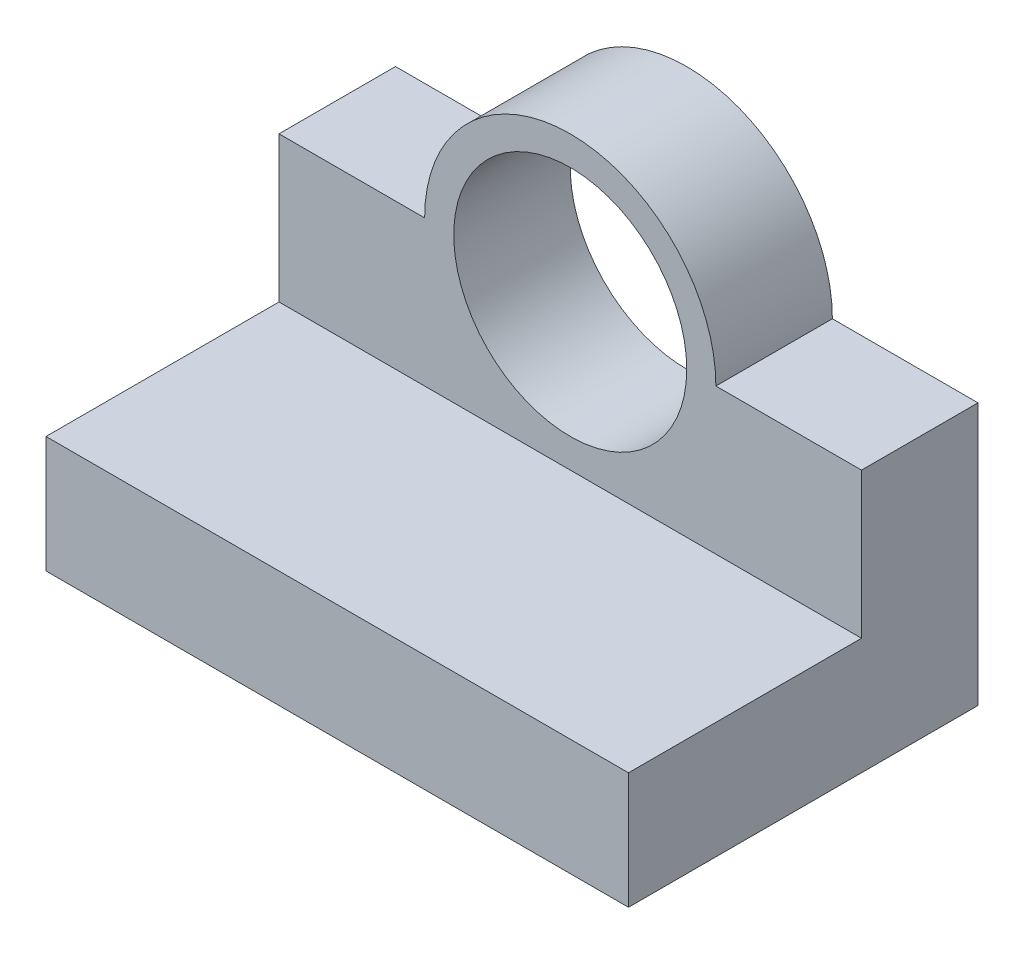
ISO-10303-21;
HEADER;
FILE_DESCRIPTION(('STEP AP214'),'2;1');
FILE_NAME('part.step','',(''),(''),'','','');
FILE_SCHEMA(('AUTOMOTIVE_DESIGN { 1 0 10303 214 1 1 1 1 }'));
ENDSEC;
DATA;
#1=APPLICATION_CONTEXT('core data for automotive mechanical design processes');
#2=APPLICATION_PROTOCOL_DEFINITION('international standard','automotive_design',2000,#1);
#3=PRODUCT_CONTEXT('',#1,'mechanical');
#4=PRODUCT('Part','Part','',(#3));
#5=PRODUCT_RELATED_PRODUCT_CATEGORY('part','',(#4));
#6=PRODUCT_DEFINITION_FORMATION('','',#4);
#7=PRODUCT_DEFINITION_CONTEXT('part definition',#1,'design');
#8=PRODUCT_DEFINITION('design','',#6,#7);
#9=PRODUCT_DEFINITION_SHAPE('','',#8);
#10=(LENGTH_UNIT() NAMED_UNIT(*) SI_UNIT(.MILLI.,.METRE.));
#11=(NAMED_UNIT(*) PLANE_ANGLE_UNIT() SI_UNIT($,.RADIAN.));
#12=(NAMED_UNIT(*) SI_UNIT($,.STERADIAN.) SOLID_ANGLE_UNIT());
#13=UNCERTAINTY_MEASURE_WITH_UNIT(LENGTH_MEASURE(1.E-05),#10,'distance_accuracy_value','');
#14=(GEOMETRIC_REPRESENTATION_CONTEXT(3) GLOBAL_UNCERTAINTY_ASSIGNED_CONTEXT((#13)) GLOBAL_UNIT_ASSIGNED_CONTEXT((#10,
#11,#12)) REPRESENTATION_CONTEXT('',''));
#15=CARTESIAN_POINT('',(0.,0.,0.));
#16=DIRECTION('',(0.,0.,1.));
#17=DIRECTION('',(1.,0.,0.));
#18=AXIS2_PLACEMENT_3D('',#15,#16,#17);
#19=CARTESIAN_POINT('',(0.,0.,20.));
#20=DIRECTION('',(0.,0.,1.));
#21=DIRECTION('',(1.,0.,0.));
#22=AXIS2_PLACEMENT_3D('',#19,#20,#21);
#23=PLANE('',#22);
#24=CARTESIAN_POINT('',(14.3829787234043,12.3510638297872,20.));
#25=DIRECTION('',(0.,0.,1.));
#26=DIRECTION('',(1.,0.,0.));
#27=AXIS2_PLACEMENT_3D('',#24,#25,#26);
#28=CIRCLE('',#27,20.);
#29=CARTESIAN_POINT('',(34.3829787234043,12.3510638297872,20.));
#30=VERTEX_POINT('',#29);
#31=EDGE_CURVE('E166',#30,#30,#28,.T.);
#32=ORIENTED_EDGE('',*,*,#31,.F.);
#33=EDGE_LOOP('',(#32));
#34=FACE_BOUND('',#33,.T.);
#35=DIRECTION('',(0.,-1.,0.));
#36=VECTOR('',#35,1.);
#37=CARTESIAN_POINT('',(-35.6170212765957,0.,20.));
#38=LINE('',#37,#36);
#39=CARTESIAN_POINT('',(-35.6170212765957,12.3510638297872,20.));
#40=VERTEX_POINT('',#39);
#41=CARTESIAN_POINT('',(-35.6170212765957,-12.6489361702128,20.));
#42=VERTEX_POINT('',#41);
#43=EDGE_CURVE('E159',#40,#42,#38,.T.);
#44=ORIENTED_EDGE('',*,*,#43,.T.);
#45=DIRECTION('',(1.,0.,0.));
#46=VECTOR('',#45,1.);
#47=CARTESIAN_POINT('',(-35.6170212765957,-12.6489361702128,20.));
#48=LINE('',#47,#46);
#49=CARTESIAN_POINT('',(64.3829787234043,-12.6489361702128,20.));
#50=VERTEX_POINT('',#49);
#51=EDGE_CURVE('E139',#42,#50,#48,.T.);
#52=ORIENTED_EDGE('',*,*,#51,.T.);
#53=DIRECTION('',(0.,-1.,0.));
#54=VECTOR('',#53,1.);
#55=CARTESIAN_POINT('',(64.3829787234043,0.,20.));
#56=LINE('',#55,#54);
#57=CARTESIAN_POINT('',(64.3829787234043,12.3510638297872,20.));
#58=VERTEX_POINT('',#57);
#59=EDGE_CURVE('E162',#58,#50,#56,.T.);
#60=ORIENTED_EDGE('',*,*,#59,.F.);
#61=DIRECTION('',(1.,0.,0.));
#62=VECTOR('',#61,1.);
#63=CARTESIAN_POINT('',(0.,12.3510638297872,20.));
#64=LINE('',#63,#62);
#65=CARTESIAN_POINT('',(39.3829787234043,12.3510638297872,20.));
#66=VERTEX_POINT('',#65);
#67=EDGE_CURVE('E164',#66,#58,#64,.T.);
#68=ORIENTED_EDGE('',*,*,#67,.F.);
#69=CARTESIAN_POINT('',(14.3829787234043,12.3510638297872,20.));
#70=DIRECTION('',(0.,0.,1.));
#71=DIRECTION('',(1.,0.,0.));
#72=AXIS2_PLACEMENT_3D('',#69,#70,#71);
#73=CIRCLE('',#72,25.);
#74=CARTESIAN_POINT('',(-10.6170212765957,12.3510638297872,20.));
#75=VERTEX_POINT('',#74);
#76=EDGE_CURVE('E153',#75,#66,#73,.F.);
#77=ORIENTED_EDGE('',*,*,#76,.F.);
#78=DIRECTION('',(1.,0.,0.));
#79=VECTOR('',#78,1.);
#80=CARTESIAN_POINT('',(0.,12.3510638297872,20.));
#81=LINE('',#80,#79);
#82=EDGE_CURVE('E155',#40,#75,#81,.T.);
#83=ORIENTED_EDGE('',*,*,#82,.F.);
#84=EDGE_LOOP('',(#44,#52,#60,#68,#77,#83));
#85=FACE_BOUND('',#84,.T.);
#86=ADVANCED_FACE('F47',(#34,#85),#23,.T.);
#87=CARTESIAN_POINT('',(14.3829787234043,12.3510638297872,20.));
#88=DIRECTION('',(0.,0.,-1.));
#89=DIRECTION('',(-1.,0.,0.));
#90=AXIS2_PLACEMENT_3D('',#87,#88,#89);
#91=CYLINDRICAL_SURFACE('',#90,25.);
#92=CARTESIAN_POINT('',(14.3829787234043,12.3510638297872,0.));
#93=DIRECTION('',(0.,0.,1.));
#94=DIRECTION('',(1.,0.,0.));
#95=AXIS2_PLACEMENT_3D('',#92,#93,#94);
#96=CIRCLE('',#95,25.);
#97=CARTESIAN_POINT('',(-10.6170212765957,12.3510638297872,0.));
#98=VERTEX_POINT('',#97);
#99=CARTESIAN_POINT('',(39.3829787234043,12.3510638297872,0.));
#100=VERTEX_POINT('',#99);
#101=EDGE_CURVE('E152',#98,#100,#96,.F.);
#102=ORIENTED_EDGE('',*,*,#101,.F.);
#103=DIRECTION('',(0.,0.,-1.));
#104=VECTOR('',#103,1.);
#105=CARTESIAN_POINT('',(-10.6170212765957,12.3510638297872,20.));
#106=LINE('',#105,#104);
#107=EDGE_CURVE('E13',#75,#98,#106,.T.);
#108=ORIENTED_EDGE('',*,*,#107,.F.);
#109=ORIENTED_EDGE('',*,*,#76,.T.);
#110=DIRECTION('',(0.,0.,-1.));
#111=VECTOR('',#110,1.);
#112=CARTESIAN_POINT('',(39.3829787234043,12.3510638297872,20.));
#113=LINE('',#112,#111);
#114=EDGE_CURVE('E71',#66,#100,#113,.T.);
#115=ORIENTED_EDGE('',*,*,#114,.T.);
#116=EDGE_LOOP('',(#102,#108,#109,#115));
#117=FACE_BOUND('',#116,.T.);
#118=ADVANCED_FACE('F49',(#117),#91,.T.);
#119=CARTESIAN_POINT('',(0.,12.3510638297872,20.));
#120=DIRECTION('',(0.,1.,0.));
#121=DIRECTION('',(-1.,0.,0.));
#122=AXIS2_PLACEMENT_3D('',#119,#120,#121);
#123=PLANE('',#122);
#124=DIRECTION('',(1.,0.,0.));
#125=VECTOR('',#124,1.);
#126=CARTESIAN_POINT('',(0.,12.3510638297872,0.));
#127=LINE('',#126,#125);
#128=CARTESIAN_POINT('',(-35.6170212765957,12.3510638297872,0.));
#129=VERTEX_POINT('',#128);
#130=EDGE_CURVE('E170',#129,#98,#127,.T.);
#131=ORIENTED_EDGE('',*,*,#130,.F.);
#132=DIRECTION('',(0.,0.,-1.));
#133=VECTOR('',#132,1.);
#134=CARTESIAN_POINT('',(-35.6170212765957,12.3510638297872,20.));
#135=LINE('',#134,#133);
#136=EDGE_CURVE('E55',#40,#129,#135,.T.);
#137=ORIENTED_EDGE('',*,*,#136,.F.);
#138=ORIENTED_EDGE('',*,*,#82,.T.);
#139=ORIENTED_EDGE('',*,*,#107,.T.);
#140=EDGE_LOOP('',(#131,#137,#138,#139));
#141=FACE_BOUND('',#140,.T.);
#142=ADVANCED_FACE('F195',(#141),#123,.T.);
#143=CARTESIAN_POINT('',(-35.6170212765957,0.,20.));
#144=DIRECTION('',(1.,0.,0.));
#145=DIRECTION('',(0.,0.,-1.));
#146=AXIS2_PLACEMENT_3D('',#143,#144,#145);
#147=PLANE('',#146);
#148=DIRECTION('',(0.,-1.,0.));
#149=VECTOR('',#148,1.);
#150=CARTESIAN_POINT('',(-35.6170212765957,0.,0.));
#151=LINE('',#150,#149);
#152=CARTESIAN_POINT('',(-35.6170212765957,-32.6489361702128,0.));
#153=VERTEX_POINT('',#152);
#154=EDGE_CURVE('E173',#129,#153,#151,.T.);
#155=ORIENTED_EDGE('',*,*,#154,.T.);
#156=DIRECTION('',(0.,0.,-1.));
#157=VECTOR('',#156,1.);
#158=CARTESIAN_POINT('',(-35.6170212765957,-32.6489361702128,20.));
#159=LINE('',#158,#157);
#160=CARTESIAN_POINT('',(-35.6170212765957,-32.6489361702128,60.));
#161=VERTEX_POINT('',#160);
#162=EDGE_CURVE('E129',#161,#153,#159,.T.);
#163=ORIENTED_EDGE('',*,*,#162,.F.);
#164=DIRECTION('',(0.,1.,0.));
#165=VECTOR('',#164,1.);
#166=CARTESIAN_POINT('',(-35.6170212765957,-32.6489361702128,60.));
#167=LINE('',#166,#165);
#168=CARTESIAN_POINT('',(-35.6170212765957,-12.6489361702128,60.));
#169=VERTEX_POINT('',#168);
#170=EDGE_CURVE('E138',#161,#169,#167,.T.);
#171=ORIENTED_EDGE('',*,*,#170,.T.);
#172=DIRECTION('',(0.,0.,-1.));
#173=VECTOR('',#172,1.);
#174=CARTESIAN_POINT('',(-35.6170212765957,-12.6489361702128,60.));
#175=LINE('',#174,#173);
#176=EDGE_CURVE('E148',#169,#42,#175,.T.);
#177=ORIENTED_EDGE('',*,*,#176,.T.);
#178=ORIENTED_EDGE('',*,*,#43,.F.);
#179=ORIENTED_EDGE('',*,*,#136,.T.);
#180=EDGE_LOOP('',(#155,#163,#171,#177,#178,#179));
#181=FACE_BOUND('',#180,.T.);
#182=ADVANCED_FACE('F188',(#181),#147,.F.);
#183=CARTESIAN_POINT('',(0.,-32.6489361702128,20.));
#184=DIRECTION('',(0.,1.,0.));
#185=DIRECTION('',(0.,0.,1.));
#186=AXIS2_PLACEMENT_3D('',#183,#184,#185);
#187=PLANE('',#186);
#188=DIRECTION('',(1.,0.,0.));
#189=VECTOR('',#188,1.);
#190=CARTESIAN_POINT('',(0.,-32.6489361702128,0.));
#191=LINE('',#190,#189);
#192=CARTESIAN_POINT('',(64.3829787234043,-32.6489361702128,0.));
#193=VERTEX_POINT('',#192);
#194=EDGE_CURVE('E124',#153,#193,#191,.T.);
#195=ORIENTED_EDGE('',*,*,#194,.T.);
#196=DIRECTION('',(0.,0.,-1.));
#197=VECTOR('',#196,1.);
#198=CARTESIAN_POINT('',(64.3829787234043,-32.6489361702128,20.));
#199=LINE('',#198,#197);
#200=CARTESIAN_POINT('',(64.3829787234043,-32.6489361702128,60.));
#201=VERTEX_POINT('',#200);
#202=EDGE_CURVE('E117',#201,#193,#199,.T.);
#203=ORIENTED_EDGE('',*,*,#202,.F.);
#204=DIRECTION('',(1.,0.,0.));
#205=VECTOR('',#204,1.);
#206=CARTESIAN_POINT('',(-35.6170212765957,-32.6489361702128,60.));
#207=LINE('',#206,#205);
#208=EDGE_CURVE('E121',#161,#201,#207,.T.);
#209=ORIENTED_EDGE('',*,*,#208,.F.);
#210=ORIENTED_EDGE('',*,*,#162,.T.);
#211=EDGE_LOOP('',(#195,#203,#209,#210));
#212=FACE_BOUND('',#211,.T.);
#213=ADVANCED_FACE('F119',(#212),#187,.F.);
#214=CARTESIAN_POINT('',(64.3829787234043,0.,20.));
#215=DIRECTION('',(1.,0.,0.));
#216=DIRECTION('',(0.,0.,-1.));
#217=AXIS2_PLACEMENT_3D('',#214,#215,#216);
#218=PLANE('',#217);
#219=DIRECTION('',(0.,-1.,0.));
#220=VECTOR('',#219,1.);
#221=CARTESIAN_POINT('',(64.3829787234043,0.,0.));
#222=LINE('',#221,#220);
#223=CARTESIAN_POINT('',(64.3829787234043,12.3510638297872,0.));
#224=VERTEX_POINT('',#223);
#225=EDGE_CURVE('E176',#224,#193,#222,.T.);
#226=ORIENTED_EDGE('',*,*,#225,.F.);
#227=DIRECTION('',(0.,0.,-1.));
#228=VECTOR('',#227,1.);
#229=CARTESIAN_POINT('',(64.3829787234043,12.3510638297872,20.));
#230=LINE('',#229,#228);
#231=EDGE_CURVE('E130',#58,#224,#230,.T.);
#232=ORIENTED_EDGE('',*,*,#231,.F.);
#233=ORIENTED_EDGE('',*,*,#59,.T.);
#234=DIRECTION('',(0.,0.,-1.));
#235=VECTOR('',#234,1.);
#236=CARTESIAN_POINT('',(64.3829787234043,-12.6489361702128,60.));
#237=LINE('',#236,#235);
#238=CARTESIAN_POINT('',(64.3829787234043,-12.6489361702128,60.));
#239=VERTEX_POINT('',#238);
#240=EDGE_CURVE('E62',#239,#50,#237,.T.);
#241=ORIENTED_EDGE('',*,*,#240,.F.);
#242=DIRECTION('',(0.,-1.,0.));
#243=VECTOR('',#242,1.);
#244=CARTESIAN_POINT('',(64.3829787234043,-12.6489361702128,60.));
#245=LINE('',#244,#243);
#246=EDGE_CURVE('E136',#239,#201,#245,.T.);
#247=ORIENTED_EDGE('',*,*,#246,.T.);
#248=ORIENTED_EDGE('',*,*,#202,.T.);
#249=EDGE_LOOP('',(#226,#232,#233,#241,#247,#248));
#250=FACE_BOUND('',#249,.T.);
#251=ADVANCED_FACE('F141',(#250),#218,.T.);
#252=CARTESIAN_POINT('',(0.,12.3510638297872,20.));
#253=DIRECTION('',(0.,1.,0.));
#254=DIRECTION('',(0.,0.,1.));
#255=AXIS2_PLACEMENT_3D('',#252,#253,#254);
#256=PLANE('',#255);
#257=DIRECTION('',(1.,0.,0.));
#258=VECTOR('',#257,1.);
#259=CARTESIAN_POINT('',(0.,12.3510638297872,0.));
#260=LINE('',#259,#258);
#261=EDGE_CURVE('E178',#100,#224,#260,.T.);
#262=ORIENTED_EDGE('',*,*,#261,.F.);
#263=ORIENTED_EDGE('',*,*,#114,.F.);
#264=ORIENTED_EDGE('',*,*,#67,.T.);
#265=ORIENTED_EDGE('',*,*,#231,.T.);
#266=EDGE_LOOP('',(#262,#263,#264,#265));
#267=FACE_BOUND('',#266,.T.);
#268=ADVANCED_FACE('F196',(#267),#256,.T.);
#269=CARTESIAN_POINT('',(14.3829787234043,12.3510638297872,20.));
#270=DIRECTION('',(0.,0.,-1.));
#271=DIRECTION('',(-1.,0.,0.));
#272=AXIS2_PLACEMENT_3D('',#269,#270,#271);
#273=CYLINDRICAL_SURFACE('',#272,20.);
#274=ORIENTED_EDGE('',*,*,#31,.T.);
#275=EDGE_LOOP('',(#274));
#276=FACE_BOUND('',#275,.T.);
#277=CARTESIAN_POINT('',(14.3829787234043,12.3510638297872,0.));
#278=DIRECTION('',(0.,0.,1.));
#279=DIRECTION('',(1.,0.,0.));
#280=AXIS2_PLACEMENT_3D('',#277,#278,#279);
#281=CIRCLE('',#280,20.);
#282=CARTESIAN_POINT('',(34.3829787234043,12.3510638297872,0.));
#283=VERTEX_POINT('',#282);
#284=EDGE_CURVE('E156',#283,#283,#281,.T.);
#285=ORIENTED_EDGE('',*,*,#284,.F.);
#286=EDGE_LOOP('',(#285));
#287=FACE_BOUND('',#286,.T.);
#288=ADVANCED_FACE('F208',(#276,#287),#273,.F.);
#289=CARTESIAN_POINT('',(0.,0.,0.));
#290=DIRECTION('',(0.,0.,1.));
#291=DIRECTION('',(1.,0.,0.));
#292=AXIS2_PLACEMENT_3D('',#289,#290,#291);
#293=PLANE('',#292);
#294=ORIENTED_EDGE('',*,*,#101,.T.);
#295=ORIENTED_EDGE('',*,*,#261,.T.);
#296=ORIENTED_EDGE('',*,*,#225,.T.);
#297=ORIENTED_EDGE('',*,*,#194,.F.);
#298=ORIENTED_EDGE('',*,*,#154,.F.);
#299=ORIENTED_EDGE('',*,*,#130,.T.);
#300=EDGE_LOOP('',(#294,#295,#296,#297,#298,#299));
#301=FACE_BOUND('',#300,.T.);
#302=ORIENTED_EDGE('',*,*,#284,.T.);
#303=EDGE_LOOP('',(#302));
#304=FACE_BOUND('',#303,.T.);
#305=ADVANCED_FACE('F193',(#301,#304),#293,.F.);
#306=CARTESIAN_POINT('',(-35.6170212765957,-12.6489361702128,60.));
#307=DIRECTION('',(0.,1.,0.));
#308=DIRECTION('',(0.,0.,1.));
#309=AXIS2_PLACEMENT_3D('',#306,#307,#308);
#310=PLANE('',#309);
#311=ORIENTED_EDGE('',*,*,#51,.F.);
#312=ORIENTED_EDGE('',*,*,#176,.F.);
#313=DIRECTION('',(1.,0.,0.));
#314=VECTOR('',#313,1.);
#315=CARTESIAN_POINT('',(-35.6170212765957,-12.6489361702128,60.));
#316=LINE('',#315,#314);
#317=EDGE_CURVE('E143',#169,#239,#316,.T.);
#318=ORIENTED_EDGE('',*,*,#317,.T.);
#319=ORIENTED_EDGE('',*,*,#240,.T.);
#320=EDGE_LOOP('',(#311,#312,#318,#319));
#321=FACE_BOUND('',#320,.T.);
#322=ADVANCED_FACE('F200',(#321),#310,.T.);
#323=CARTESIAN_POINT('',(0.,0.,60.));
#324=DIRECTION('',(0.,0.,-1.));
#325=DIRECTION('',(-1.,0.,0.));
#326=AXIS2_PLACEMENT_3D('',#323,#324,#325);
#327=PLANE('',#326);
#328=ORIENTED_EDGE('',*,*,#208,.T.);
#329=ORIENTED_EDGE('',*,*,#246,.F.);
#330=ORIENTED_EDGE('',*,*,#317,.F.);
#331=ORIENTED_EDGE('',*,*,#170,.F.);
#332=EDGE_LOOP('',(#328,#329,#330,#331));
#333=FACE_BOUND('',#332,.T.);
#334=ADVANCED_FACE('F134',(#333),#327,.F.);
#335=CLOSED_SHELL('',(#86,#118,#142,#182,#213,#251,#268,#288,#305,#322,#334));
#336=MANIFOLD_SOLID_BREP('B2',#335);
#337=ADVANCED_BREP_SHAPE_REPRESENTATION('',(#18,#336),#14);
#338=SHAPE_DEFINITION_REPRESENTATION(#9,#337);
ENDSEC;
END-ISO-10303-21;
